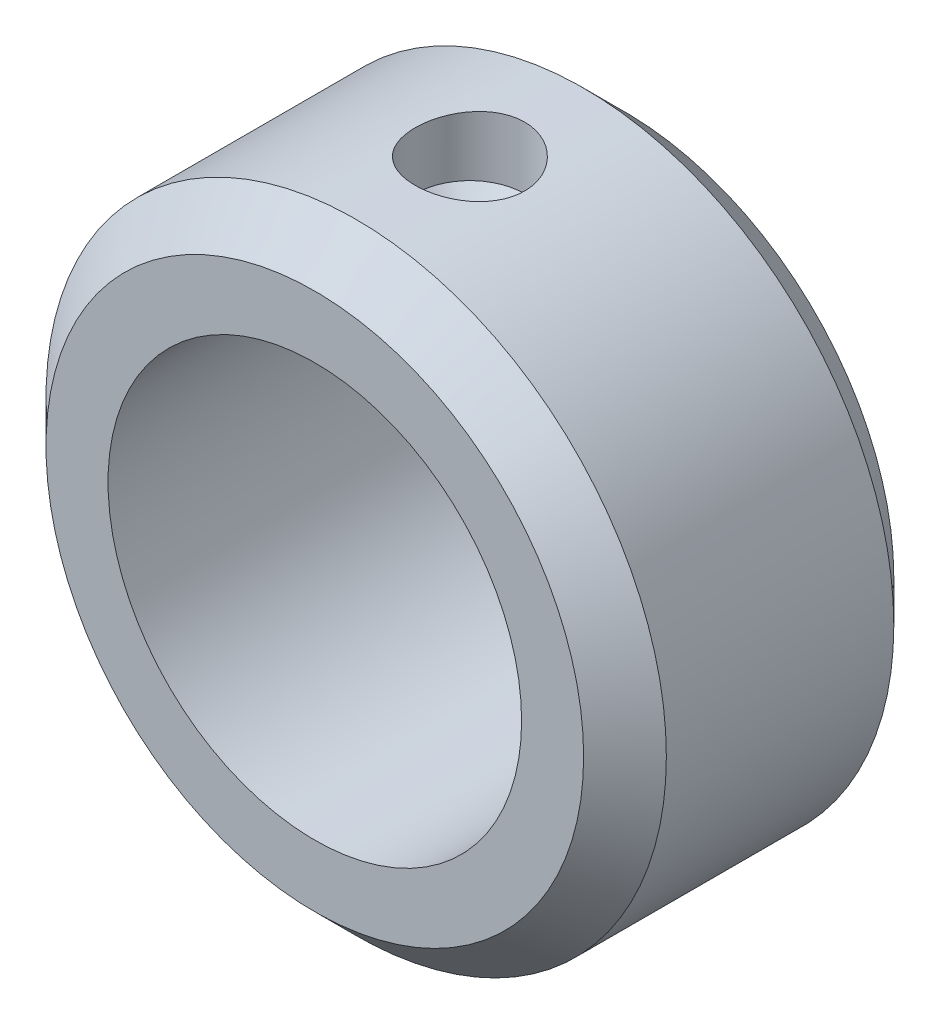
ISO-10303-21;
HEADER;
FILE_DESCRIPTION(('STEP AP214'),'2;1');
FILE_NAME('part.step','',(''),(''),'','','');
FILE_SCHEMA(('AUTOMOTIVE_DESIGN { 1 0 10303 214 1 1 1 1 }'));
ENDSEC;
DATA;
#1=APPLICATION_CONTEXT('core data for automotive mechanical design processes');
#2=APPLICATION_PROTOCOL_DEFINITION('international standard','automotive_design',2000,#1);
#3=PRODUCT_CONTEXT('',#1,'mechanical');
#4=PRODUCT('Part','Part','',(#3));
#5=PRODUCT_RELATED_PRODUCT_CATEGORY('part','',(#4));
#6=PRODUCT_DEFINITION_FORMATION('','',#4);
#7=PRODUCT_DEFINITION_CONTEXT('part definition',#1,'design');
#8=PRODUCT_DEFINITION('design','',#6,#7);
#9=PRODUCT_DEFINITION_SHAPE('','',#8);
#10=(LENGTH_UNIT() NAMED_UNIT(*) SI_UNIT(.MILLI.,.METRE.));
#11=(NAMED_UNIT(*) PLANE_ANGLE_UNIT() SI_UNIT($,.RADIAN.));
#12=(NAMED_UNIT(*) SI_UNIT($,.STERADIAN.) SOLID_ANGLE_UNIT());
#13=UNCERTAINTY_MEASURE_WITH_UNIT(LENGTH_MEASURE(1.E-05),#10,'distance_accuracy_value','');
#14=(GEOMETRIC_REPRESENTATION_CONTEXT(3) GLOBAL_UNCERTAINTY_ASSIGNED_CONTEXT((#13)) GLOBAL_UNIT_ASSIGNED_CONTEXT((#10,
#11,#12)) REPRESENTATION_CONTEXT('',''));
#15=CARTESIAN_POINT('',(0.,0.,0.));
#16=DIRECTION('',(0.,0.,1.));
#17=DIRECTION('',(1.,0.,0.));
#18=AXIS2_PLACEMENT_3D('',#15,#16,#17);
#19=CARTESIAN_POINT('',(0.,0.,15.));
#20=DIRECTION('',(0.,0.,-1.));
#21=DIRECTION('',(-1.,0.,0.));
#22=AXIS2_PLACEMENT_3D('',#19,#20,#21);
#23=CYLINDRICAL_SURFACE('',#22,15.);
#24=CARTESIAN_POINT('',(0.,0.,2.00000000000001));
#25=DIRECTION('',(0.,0.,1.));
#26=DIRECTION('',(1.,0.,0.));
#27=AXIS2_PLACEMENT_3D('',#24,#25,#26);
#28=CIRCLE('',#27,15.);
#29=CARTESIAN_POINT('',(15.,0.,2.00000000000001));
#30=VERTEX_POINT('',#29);
#31=EDGE_CURVE('E86',#30,#30,#28,.T.);
#32=ORIENTED_EDGE('',*,*,#31,.T.);
#33=EDGE_LOOP('',(#32));
#34=FACE_BOUND('',#33,.T.);
#35=CARTESIAN_POINT('',(0.,0.,13.));
#36=DIRECTION('',(0.,0.,1.));
#37=DIRECTION('',(1.,0.,0.));
#38=AXIS2_PLACEMENT_3D('',#35,#36,#37);
#39=CIRCLE('',#38,15.);
#40=CARTESIAN_POINT('',(15.,0.,13.));
#41=VERTEX_POINT('',#40);
#42=EDGE_CURVE('E92',#41,#41,#39,.F.);
#43=ORIENTED_EDGE('',*,*,#42,.T.);
#44=EDGE_LOOP('',(#43));
#45=FACE_BOUND('',#44,.T.);
#46=CARTESIAN_POINT('',(0.,15.,4.85));
#47=CARTESIAN_POINT('',(-0.147620333318209,14.9999973922296,4.85000579573483));
#48=CARTESIAN_POINT('',(-0.295317900709382,14.9977982169946,4.86237663728625));
#49=CARTESIAN_POINT('',(-0.586561451181632,14.9892371300302,4.91150732290372));
#50=CARTESIAN_POINT('',(-0.730103645480495,14.9828715369912,4.94828873574825));
#51=CARTESIAN_POINT('',(-1.00878140283525,14.9666907100878,5.04508776995221));
#52=CARTESIAN_POINT('',(-1.14392406251512,14.9568784362085,5.10508545781777));
#53=CARTESIAN_POINT('',(-1.40220961964678,14.934879679842,5.24655964268963));
#54=CARTESIAN_POINT('',(-1.52535369978433,14.9226934317105,5.32803401982473));
#55=CARTESIAN_POINT('',(-1.75747767693217,14.8971492873075,5.51107423594565));
#56=CARTESIAN_POINT('',(-1.8663107445765,14.8837812944398,5.61282488839327));
#57=CARTESIAN_POINT('',(-2.06545410379003,14.8574564941135,5.83313161477148));
#58=CARTESIAN_POINT('',(-2.15576315323055,14.844499714278,5.95168881476486));
#59=CARTESIAN_POINT('',(-2.31589382082876,14.8203664502272,6.20326550316352));
#60=CARTESIAN_POINT('',(-2.38556829022923,14.8092030008842,6.33638001293648));
#61=CARTESIAN_POINT('',(-2.50151054861971,14.7900615246376,6.61265425757155));
#62=CARTESIAN_POINT('',(-2.54778012073755,14.7820832550772,6.75581322623897));
#63=CARTESIAN_POINT('',(-2.61513248648099,14.7703165339349,7.04654917998554));
#64=CARTESIAN_POINT('',(-2.63647000106561,14.7664857394435,7.19406540916137));
#65=CARTESIAN_POINT('',(-2.65414273447939,14.763319829632,7.49063016169813));
#66=CARTESIAN_POINT('',(-2.65047994178203,14.7639843567631,7.63967856225171));
#67=CARTESIAN_POINT('',(-2.61846307595289,14.769695396291,7.93324584689695));
#68=CARTESIAN_POINT('',(-2.59039676713021,14.7746908369183,8.07779725412535));
#69=CARTESIAN_POINT('',(-2.51082190744544,14.7884207731712,8.36010678799927));
#70=CARTESIAN_POINT('',(-2.4593124625119,14.7971554114012,8.49786465533149));
#71=CARTESIAN_POINT('',(-2.33402657662121,14.8174339112599,8.76352905006515));
#72=CARTESIAN_POINT('',(-2.26013218249447,14.8289925896278,8.89137877381981));
#73=CARTESIAN_POINT('',(-2.09225757943735,14.8536067468445,9.13297295191817));
#74=CARTESIAN_POINT('',(-1.9982755542617,14.866662360991,9.24671612933244));
#75=CARTESIAN_POINT('',(-1.79133323610992,14.8930228961157,9.45853276393845));
#76=CARTESIAN_POINT('',(-1.67812639527091,14.9063287536349,9.55636538994592));
#77=CARTESIAN_POINT('',(-1.43677767415874,14.9315225873254,9.73168459090271));
#78=CARTESIAN_POINT('',(-1.30863567428618,14.9434105521406,9.80917100290522));
#79=CARTESIAN_POINT('',(-1.04081614742377,14.9644492193481,9.94162642014146));
#80=CARTESIAN_POINT('',(-0.901126996536926,14.9735971195743,9.99657239514849));
#81=CARTESIAN_POINT('',(-0.614304842568227,14.9881028713885,10.0821544474717));
#82=CARTESIAN_POINT('',(-0.467172541635639,14.9934610797652,10.1127928133131));
#83=CARTESIAN_POINT('',(-0.171714598017171,14.9997352669483,10.1485593958754));
#84=CARTESIAN_POINT('',(-0.0234301212094458,15.000708760807,10.1540179239802));
#85=CARTESIAN_POINT('',(0.271933604115552,14.9982619885225,10.1401530233097));
#86=CARTESIAN_POINT('',(0.41901290467817,14.9948419131319,10.1208306704297));
#87=CARTESIAN_POINT('',(0.706758178338784,14.9840279827739,10.0582272023109));
#88=CARTESIAN_POINT('',(0.847461215779548,14.9766615401094,10.0151113006324));
#89=CARTESIAN_POINT('',(1.11964180086303,14.9587774198932,9.90632199896188));
#90=CARTESIAN_POINT('',(1.25111877797357,14.9482595476712,9.84064720542385));
#91=CARTESIAN_POINT('',(1.50253821538124,14.9250960569133,9.68785974922605));
#92=CARTESIAN_POINT('',(1.62235469105862,14.9124305531338,9.60054284702862));
#93=CARTESIAN_POINT('',(1.84575260065349,14.8864323752521,9.40722858030246));
#94=CARTESIAN_POINT('',(1.94933269825256,14.8730996463537,9.30122967969466));
#95=CARTESIAN_POINT('',(2.13855638173508,14.8470814543912,9.07207223286868));
#96=CARTESIAN_POINT('',(2.22397572285607,14.8344053992785,8.94872727868487));
#97=CARTESIAN_POINT('',(2.37288215840757,14.8113176925869,8.68924497659866));
#98=CARTESIAN_POINT('',(2.43637000740782,14.8009059631068,8.55310806901823));
#99=CARTESIAN_POINT('',(2.53928396210434,14.7835978769185,8.27250636232753));
#100=CARTESIAN_POINT('',(2.57881755946619,14.7766858391198,8.12808199869236));
#101=CARTESIAN_POINT('',(2.63303610116875,14.7671219973513,7.83450899497004));
#102=CARTESIAN_POINT('',(2.64772350181805,14.7644697722553,7.68536082336642));
#103=CARTESIAN_POINT('',(2.65175780129159,14.7637455142644,7.38881631384261));
#104=CARTESIAN_POINT('',(2.64145799598758,14.7656096240972,7.2414248206563));
#105=CARTESIAN_POINT('',(2.59657864471586,14.7735672804478,6.9505082572016));
#106=CARTESIAN_POINT('',(2.56199920680777,14.7796608081421,6.80698316972823));
#107=CARTESIAN_POINT('',(2.46968400946471,14.7953652116113,6.52803513400526));
#108=CARTESIAN_POINT('',(2.41198233549979,14.8049709081322,6.39260059534586));
#109=CARTESIAN_POINT('',(2.27509791060877,14.8266216712692,6.13327758732491));
#110=CARTESIAN_POINT('',(2.1959138808624,14.8386668830961,6.00938980591879));
#111=CARTESIAN_POINT('',(2.01706673608697,14.8640399825244,5.77489905621498));
#112=CARTESIAN_POINT('',(1.91714497356382,14.8773828138312,5.66449494544568));
#113=CARTESIAN_POINT('',(1.70020168657915,14.903732060013,5.46190167517034));
#114=CARTESIAN_POINT('',(1.58317623258913,14.9167383967689,5.36971671294543));
#115=CARTESIAN_POINT('',(1.33424924931608,14.9410684431378,5.20550871728741));
#116=CARTESIAN_POINT('',(1.20223799607769,14.9523781197524,5.13364989783356));
#117=CARTESIAN_POINT('',(0.927865902577723,14.9719039524011,5.01324208293331));
#118=CARTESIAN_POINT('',(0.785515253526299,14.9801231065892,4.96467048361555));
#119=CARTESIAN_POINT('',(0.535560062400754,14.990802790714,4.90244342522015));
#120=CARTESIAN_POINT('',(0.429445023003731,14.9942328280106,4.88280960861778));
#121=CARTESIAN_POINT('',(0.215567029372474,14.99883236134,4.85658591543896));
#122=CARTESIAN_POINT('',(0.107804109468843,15.0000019044014,4.84999576749342));
#123=CARTESIAN_POINT('',(0.,15.,4.85));
#124=B_SPLINE_CURVE_WITH_KNOTS('',3,(#46,#47,#48,#49,#50,#51,#52,#53,#54,#55,#56,#57,#58,#59,
#60,#61,#62,#63,#64,#65,#66,#67,#68,#69,#70,#71,#72,#73,#74,#75,#76,#77,#78,#79,#80,#81,#82,#83,
#84,#85,#86,#87,#88,#89,#90,#91,#92,#93,#94,#95,#96,#97,#98,#99,#100,#101,#102,#103,#104,#105,
#106,#107,#108,#109,#110,#111,#112,#113,#114,#115,#116,#117,#118,#119,#120,#121,#122,#123),
.UNSPECIFIED.,.T.,.F.,(4,2,2,2,2,2,2,2,2,2,2,2,2,2,2,2,2,2,2,2,2,2,2,2,2,2,2,2,2,2,2,2,2,2,2,2,
2,2,4),(0.,0.442466857092177,0.885325192041802,1.32780412951694,1.77023940815142,
2.21690879227259,2.66360811804006,3.11342019997566,3.56319800732003,4.00833928204956,
4.45344515156246,4.89337247626185,5.33331658026165,5.77562044431229,6.2179643166837,
6.66648132459254,7.11500192443218,7.56397965637356,8.01291511271317,8.45594432402176,
8.89895430127119,9.33892619663628,9.77892527557807,10.2232462994407,10.6676038735097,
11.1171649813216,11.5667106200994,12.0142237447566,12.4616926254357,12.9028716755771,
13.344048762207,13.7845778694765,14.2251332067006,14.6715547048855,15.1180789289436,
15.568113785261,16.017710923859,16.3408421405025,16.6639666344397),.UNSPECIFIED.);
#125=CARTESIAN_POINT('',(0.,15.,4.85));
#126=VERTEX_POINT('',#125);
#127=EDGE_CURVE('E12',#126,#126,#124,.T.);
#128=ORIENTED_EDGE('',*,*,#127,.F.);
#129=EDGE_LOOP('',(#128));
#130=FACE_BOUND('',#129,.T.);
#131=ADVANCED_FACE('F58',(#34,#45,#130),#23,.T.);
#132=CARTESIAN_POINT('',(0.,0.,15.));
#133=DIRECTION('',(0.,0.,1.));
#134=DIRECTION('',(1.,0.,0.));
#135=AXIS2_PLACEMENT_3D('',#132,#133,#134);
#136=PLANE('',#135);
#137=CARTESIAN_POINT('',(0.,0.,15.));
#138=DIRECTION('',(0.,0.,1.));
#139=DIRECTION('',(1.,0.,0.));
#140=AXIS2_PLACEMENT_3D('',#137,#138,#139);
#141=CIRCLE('',#140,13.);
#142=CARTESIAN_POINT('',(13.,0.,15.));
#143=VERTEX_POINT('',#142);
#144=EDGE_CURVE('E72',#143,#143,#141,.T.);
#145=ORIENTED_EDGE('',*,*,#144,.T.);
#146=EDGE_LOOP('',(#145));
#147=FACE_BOUND('',#146,.T.);
#148=CARTESIAN_POINT('',(0.,0.,15.));
#149=DIRECTION('',(0.,0.,1.));
#150=DIRECTION('',(1.,0.,0.));
#151=AXIS2_PLACEMENT_3D('',#148,#149,#150);
#152=CIRCLE('',#151,10.);
#153=CARTESIAN_POINT('',(10.,0.,15.));
#154=VERTEX_POINT('',#153);
#155=EDGE_CURVE('E96',#154,#154,#152,.T.);
#156=ORIENTED_EDGE('',*,*,#155,.F.);
#157=EDGE_LOOP('',(#156));
#158=FACE_BOUND('',#157,.T.);
#159=ADVANCED_FACE('F127',(#147,#158),#136,.T.);
#160=CARTESIAN_POINT('',(0.,0.,0.));
#161=DIRECTION('',(0.,0.,1.));
#162=DIRECTION('',(1.,0.,0.));
#163=AXIS2_PLACEMENT_3D('',#160,#161,#162);
#164=PLANE('',#163);
#165=CARTESIAN_POINT('',(0.,0.,0.));
#166=DIRECTION('',(0.,0.,1.));
#167=DIRECTION('',(1.,0.,0.));
#168=AXIS2_PLACEMENT_3D('',#165,#166,#167);
#169=CIRCLE('',#168,13.);
#170=CARTESIAN_POINT('',(13.,0.,0.));
#171=VERTEX_POINT('',#170);
#172=EDGE_CURVE('E79',#171,#171,#169,.F.);
#173=ORIENTED_EDGE('',*,*,#172,.T.);
#174=EDGE_LOOP('',(#173));
#175=FACE_BOUND('',#174,.T.);
#176=CARTESIAN_POINT('',(0.,0.,0.));
#177=DIRECTION('',(0.,0.,1.));
#178=DIRECTION('',(1.,0.,0.));
#179=AXIS2_PLACEMENT_3D('',#176,#177,#178);
#180=CIRCLE('',#179,10.);
#181=CARTESIAN_POINT('',(10.,0.,0.));
#182=VERTEX_POINT('',#181);
#183=EDGE_CURVE('E97',#182,#182,#180,.T.);
#184=ORIENTED_EDGE('',*,*,#183,.T.);
#185=EDGE_LOOP('',(#184));
#186=FACE_BOUND('',#185,.T.);
#187=ADVANCED_FACE('F132',(#175,#186),#164,.F.);
#188=CARTESIAN_POINT('',(0.,0.,15.));
#189=DIRECTION('',(0.,0.,-1.));
#190=DIRECTION('',(-1.,0.,0.));
#191=AXIS2_PLACEMENT_3D('',#188,#189,#190);
#192=CYLINDRICAL_SURFACE('',#191,10.);
#193=ORIENTED_EDGE('',*,*,#155,.T.);
#194=EDGE_LOOP('',(#193));
#195=FACE_BOUND('',#194,.T.);
#196=ORIENTED_EDGE('',*,*,#183,.F.);
#197=EDGE_LOOP('',(#196));
#198=FACE_BOUND('',#197,.T.);
#199=ADVANCED_FACE('F142',(#195,#198),#192,.F.);
#200=CARTESIAN_POINT('',(0.,0.,2.00000000000001));
#201=DIRECTION('',(0.,0.,1.));
#202=DIRECTION('',(1.,0.,0.));
#203=AXIS2_PLACEMENT_3D('',#200,#201,#202);
#204=CONICAL_SURFACE('',#203,15.,0.78539816339745);
#205=ORIENTED_EDGE('',*,*,#172,.F.);
#206=EDGE_LOOP('',(#205));
#207=FACE_BOUND('',#206,.T.);
#208=ORIENTED_EDGE('',*,*,#31,.F.);
#209=EDGE_LOOP('',(#208));
#210=FACE_BOUND('',#209,.T.);
#211=ADVANCED_FACE('F138',(#207,#210),#204,.T.);
#212=CARTESIAN_POINT('',(0.,0.,15.));
#213=DIRECTION('',(0.,0.,-1.));
#214=DIRECTION('',(-1.,0.,0.));
#215=AXIS2_PLACEMENT_3D('',#212,#213,#214);
#216=CONICAL_SURFACE('',#215,13.,0.785398163397448);
#217=ORIENTED_EDGE('',*,*,#42,.F.);
#218=EDGE_LOOP('',(#217));
#219=FACE_BOUND('',#218,.T.);
#220=ORIENTED_EDGE('',*,*,#144,.F.);
#221=EDGE_LOOP('',(#220));
#222=FACE_BOUND('',#221,.T.);
#223=ADVANCED_FACE('F61',(#219,#222),#216,.T.);
#224=CARTESIAN_POINT('',(0.,0.,7.5));
#225=DIRECTION('',(0.,-1.,0.));
#226=DIRECTION('',(0.,0.,-1.));
#227=AXIS2_PLACEMENT_3D('',#224,#225,#226);
#228=CYLINDRICAL_SURFACE('',#227,2.65);
#229=CARTESIAN_POINT('',(0.,12.,7.5));
#230=DIRECTION('',(0.,-1.,0.));
#231=DIRECTION('',(0.,0.,-1.));
#232=AXIS2_PLACEMENT_3D('',#229,#230,#231);
#233=CIRCLE('',#232,2.65);
#234=CARTESIAN_POINT('',(0.,12.,4.85));
#235=VERTEX_POINT('',#234);
#236=EDGE_CURVE('E101',#235,#235,#233,.T.);
#237=ORIENTED_EDGE('',*,*,#236,.T.);
#238=EDGE_LOOP('',(#237));
#239=FACE_BOUND('',#238,.T.);
#240=ORIENTED_EDGE('',*,*,#127,.T.);
#241=EDGE_LOOP('',(#240));
#242=FACE_BOUND('',#241,.T.);
#243=ADVANCED_FACE('F124',(#239,#242),#228,.F.);
#244=CARTESIAN_POINT('',(0.,12.,7.5));
#245=DIRECTION('',(0.,1.,0.));
#246=DIRECTION('',(0.,0.,1.));
#247=AXIS2_PLACEMENT_3D('',#244,#245,#246);
#248=CONICAL_SURFACE('',#247,2.65,0.785398163397452);
#249=CARTESIAN_POINT('',(0.,10.35,7.5));
#250=DIRECTION('',(0.,-1.,0.));
#251=DIRECTION('',(0.,0.,-1.));
#252=AXIS2_PLACEMENT_3D('',#249,#250,#251);
#253=CIRCLE('',#252,1.);
#254=CARTESIAN_POINT('',(0.,10.35,6.5));
#255=VERTEX_POINT('',#254);
#256=EDGE_CURVE('E108',#255,#255,#253,.T.);
#257=ORIENTED_EDGE('',*,*,#256,.T.);
#258=EDGE_LOOP('',(#257));
#259=FACE_BOUND('',#258,.T.);
#260=ORIENTED_EDGE('',*,*,#236,.F.);
#261=EDGE_LOOP('',(#260));
#262=FACE_BOUND('',#261,.T.);
#263=ADVANCED_FACE('F115',(#259,#262),#248,.F.);
#264=CARTESIAN_POINT('',(0.,10.35,7.5));
#265=DIRECTION('',(0.,1.,0.));
#266=DIRECTION('',(0.,0.,1.));
#267=AXIS2_PLACEMENT_3D('',#264,#265,#266);
#268=PLANE('',#267);
#269=ORIENTED_EDGE('',*,*,#256,.F.);
#270=EDGE_LOOP('',(#269));
#271=FACE_BOUND('',#270,.T.);
#272=ADVANCED_FACE('F118',(#271),#268,.T.);
#273=CLOSED_SHELL('',(#131,#159,#187,#199,#211,#223,#243,#263,#272));
#274=MANIFOLD_SOLID_BREP('B2',#273);
#275=ADVANCED_BREP_SHAPE_REPRESENTATION('',(#18,#274),#14);
#276=SHAPE_DEFINITION_REPRESENTATION(#9,#275);
ENDSEC;
END-ISO-10303-21;
